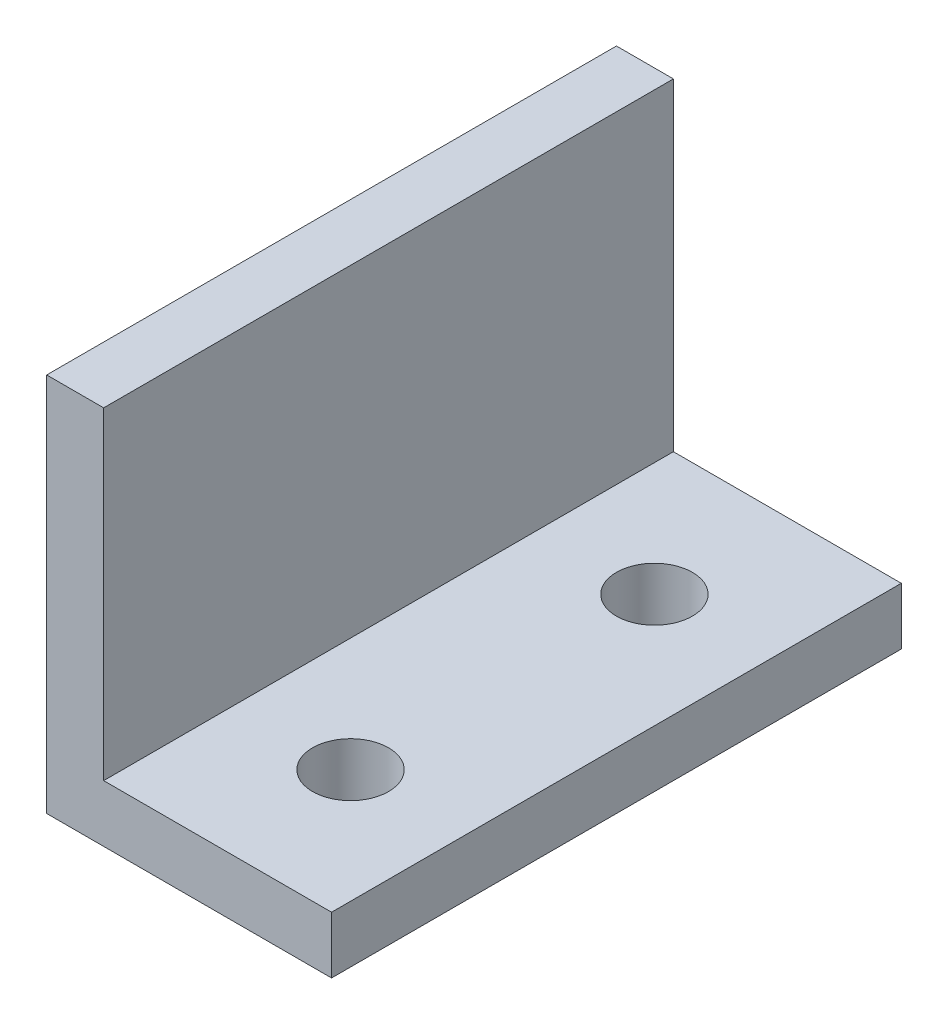
ISO-10303-21;
HEADER;
FILE_DESCRIPTION(('STEP AP214'),'2;1');
FILE_NAME('part.step','',(''),(''),'','','');
FILE_SCHEMA(('AUTOMOTIVE_DESIGN { 1 0 10303 214 1 1 1 1 }'));
ENDSEC;
DATA;
#1=APPLICATION_CONTEXT('core data for automotive mechanical design processes');
#2=APPLICATION_PROTOCOL_DEFINITION('international standard','automotive_design',2000,#1);
#3=PRODUCT_CONTEXT('',#1,'mechanical');
#4=PRODUCT('Part','Part','',(#3));
#5=PRODUCT_RELATED_PRODUCT_CATEGORY('part','',(#4));
#6=PRODUCT_DEFINITION_FORMATION('','',#4);
#7=PRODUCT_DEFINITION_CONTEXT('part definition',#1,'design');
#8=PRODUCT_DEFINITION('design','',#6,#7);
#9=PRODUCT_DEFINITION_SHAPE('','',#8);
#10=(LENGTH_UNIT() NAMED_UNIT(*) SI_UNIT(.MILLI.,.METRE.));
#11=(NAMED_UNIT(*) PLANE_ANGLE_UNIT() SI_UNIT($,.RADIAN.));
#12=(NAMED_UNIT(*) SI_UNIT($,.STERADIAN.) SOLID_ANGLE_UNIT());
#13=UNCERTAINTY_MEASURE_WITH_UNIT(LENGTH_MEASURE(1.E-05),#10,'distance_accuracy_value','');
#14=(GEOMETRIC_REPRESENTATION_CONTEXT(3) GLOBAL_UNCERTAINTY_ASSIGNED_CONTEXT((#13)) GLOBAL_UNIT_ASSIGNED_CONTEXT((#10,
#11,#12)) REPRESENTATION_CONTEXT('',''));
#15=CARTESIAN_POINT('',(0.,0.,0.));
#16=DIRECTION('',(0.,0.,1.));
#17=DIRECTION('',(1.,0.,0.));
#18=AXIS2_PLACEMENT_3D('',#15,#16,#17);
#19=CARTESIAN_POINT('',(0.,0.,30.));
#20=DIRECTION('',(0.,1.,0.));
#21=DIRECTION('',(0.,0.,1.));
#22=AXIS2_PLACEMENT_3D('',#19,#20,#21);
#23=PLANE('',#22);
#24=CARTESIAN_POINT('',(9.,0.,23.));
#25=DIRECTION('',(0.,1.,0.));
#26=DIRECTION('',(1.,0.,0.));
#27=AXIS2_PLACEMENT_3D('',#24,#25,#26);
#28=CIRCLE('',#27,2.);
#29=CARTESIAN_POINT('',(11.,0.,23.));
#30=VERTEX_POINT('',#29);
#31=EDGE_CURVE('E125',#30,#30,#28,.T.);
#32=ORIENTED_EDGE('',*,*,#31,.T.);
#33=EDGE_LOOP('',(#32));
#34=FACE_BOUND('',#33,.T.);
#35=CARTESIAN_POINT('',(9.,0.,7.));
#36=DIRECTION('',(0.,1.,0.));
#37=DIRECTION('',(-1.,0.,0.));
#38=AXIS2_PLACEMENT_3D('',#35,#36,#37);
#39=CIRCLE('',#38,2.);
#40=CARTESIAN_POINT('',(7.,0.,7.));
#41=VERTEX_POINT('',#40);
#42=EDGE_CURVE('E166',#41,#41,#39,.T.);
#43=ORIENTED_EDGE('',*,*,#42,.T.);
#44=EDGE_LOOP('',(#43));
#45=FACE_BOUND('',#44,.T.);
#46=DIRECTION('',(1.,0.,0.));
#47=VECTOR('',#46,1.);
#48=CARTESIAN_POINT('',(0.,0.,0.));
#49=LINE('',#48,#47);
#50=CARTESIAN_POINT('',(0.,0.,0.));
#51=VERTEX_POINT('',#50);
#52=CARTESIAN_POINT('',(15.,0.,0.));
#53=VERTEX_POINT('',#52);
#54=EDGE_CURVE('E121',#51,#53,#49,.T.);
#55=ORIENTED_EDGE('',*,*,#54,.T.);
#56=DIRECTION('',(0.,0.,-1.));
#57=VECTOR('',#56,1.);
#58=CARTESIAN_POINT('',(15.,0.,30.));
#59=LINE('',#58,#57);
#60=CARTESIAN_POINT('',(15.,0.,30.));
#61=VERTEX_POINT('',#60);
#62=EDGE_CURVE('E11',#61,#53,#59,.T.);
#63=ORIENTED_EDGE('',*,*,#62,.F.);
#64=DIRECTION('',(1.,0.,0.));
#65=VECTOR('',#64,1.);
#66=CARTESIAN_POINT('',(0.,0.,30.));
#67=LINE('',#66,#65);
#68=CARTESIAN_POINT('',(0.,0.,30.));
#69=VERTEX_POINT('',#68);
#70=EDGE_CURVE('E132',#69,#61,#67,.T.);
#71=ORIENTED_EDGE('',*,*,#70,.F.);
#72=DIRECTION('',(0.,0.,-1.));
#73=VECTOR('',#72,1.);
#74=CARTESIAN_POINT('',(0.,0.,30.));
#75=LINE('',#74,#73);
#76=EDGE_CURVE('E117',#69,#51,#75,.T.);
#77=ORIENTED_EDGE('',*,*,#76,.T.);
#78=EDGE_LOOP('',(#55,#63,#71,#77));
#79=FACE_BOUND('',#78,.T.);
#80=ADVANCED_FACE('F37',(#34,#45,#79),#23,.F.);
#81=CARTESIAN_POINT('',(15.,0.,30.));
#82=DIRECTION('',(-1.,0.,0.));
#83=DIRECTION('',(0.,0.,1.));
#84=AXIS2_PLACEMENT_3D('',#81,#82,#83);
#85=PLANE('',#84);
#86=DIRECTION('',(0.,1.,0.));
#87=VECTOR('',#86,1.);
#88=CARTESIAN_POINT('',(15.,0.,0.));
#89=LINE('',#88,#87);
#90=CARTESIAN_POINT('',(15.,3.,0.));
#91=VERTEX_POINT('',#90);
#92=EDGE_CURVE('E124',#53,#91,#89,.T.);
#93=ORIENTED_EDGE('',*,*,#92,.T.);
#94=DIRECTION('',(0.,0.,-1.));
#95=VECTOR('',#94,1.);
#96=CARTESIAN_POINT('',(15.,3.,30.));
#97=LINE('',#96,#95);
#98=CARTESIAN_POINT('',(15.,3.,30.));
#99=VERTEX_POINT('',#98);
#100=EDGE_CURVE('E45',#99,#91,#97,.T.);
#101=ORIENTED_EDGE('',*,*,#100,.F.);
#102=DIRECTION('',(0.,1.,0.));
#103=VECTOR('',#102,1.);
#104=CARTESIAN_POINT('',(15.,0.,30.));
#105=LINE('',#104,#103);
#106=EDGE_CURVE('E90',#61,#99,#105,.T.);
#107=ORIENTED_EDGE('',*,*,#106,.F.);
#108=ORIENTED_EDGE('',*,*,#62,.T.);
#109=EDGE_LOOP('',(#93,#101,#107,#108));
#110=FACE_BOUND('',#109,.T.);
#111=ADVANCED_FACE('F156',(#110),#85,.F.);
#112=CARTESIAN_POINT('',(15.,3.,30.));
#113=DIRECTION('',(0.,-1.,0.));
#114=DIRECTION('',(1.,0.,0.));
#115=AXIS2_PLACEMENT_3D('',#112,#113,#114);
#116=PLANE('',#115);
#117=CARTESIAN_POINT('',(9.,3.,23.));
#118=DIRECTION('',(0.,1.,0.));
#119=DIRECTION('',(1.,0.,0.));
#120=AXIS2_PLACEMENT_3D('',#117,#118,#119);
#121=CIRCLE('',#120,2.);
#122=CARTESIAN_POINT('',(11.,3.,23.));
#123=VERTEX_POINT('',#122);
#124=EDGE_CURVE('E171',#123,#123,#121,.T.);
#125=ORIENTED_EDGE('',*,*,#124,.F.);
#126=EDGE_LOOP('',(#125));
#127=FACE_BOUND('',#126,.T.);
#128=CARTESIAN_POINT('',(9.,3.,7.));
#129=DIRECTION('',(0.,1.,0.));
#130=DIRECTION('',(-1.,0.,0.));
#131=AXIS2_PLACEMENT_3D('',#128,#129,#130);
#132=CIRCLE('',#131,2.);
#133=CARTESIAN_POINT('',(7.,3.,7.));
#134=VERTEX_POINT('',#133);
#135=EDGE_CURVE('E168',#134,#134,#132,.T.);
#136=ORIENTED_EDGE('',*,*,#135,.F.);
#137=EDGE_LOOP('',(#136));
#138=FACE_BOUND('',#137,.T.);
#139=DIRECTION('',(-1.,0.,0.));
#140=VECTOR('',#139,1.);
#141=CARTESIAN_POINT('',(15.,3.,0.));
#142=LINE('',#141,#140);
#143=CARTESIAN_POINT('',(3.,3.,0.));
#144=VERTEX_POINT('',#143);
#145=EDGE_CURVE('E127',#91,#144,#142,.T.);
#146=ORIENTED_EDGE('',*,*,#145,.T.);
#147=DIRECTION('',(0.,0.,-1.));
#148=VECTOR('',#147,1.);
#149=CARTESIAN_POINT('',(3.,3.,30.));
#150=LINE('',#149,#148);
#151=CARTESIAN_POINT('',(3.,3.,30.));
#152=VERTEX_POINT('',#151);
#153=EDGE_CURVE('E112',#152,#144,#150,.T.);
#154=ORIENTED_EDGE('',*,*,#153,.F.);
#155=DIRECTION('',(-1.,0.,0.));
#156=VECTOR('',#155,1.);
#157=CARTESIAN_POINT('',(15.,3.,30.));
#158=LINE('',#157,#156);
#159=EDGE_CURVE('E103',#99,#152,#158,.T.);
#160=ORIENTED_EDGE('',*,*,#159,.F.);
#161=ORIENTED_EDGE('',*,*,#100,.T.);
#162=EDGE_LOOP('',(#146,#154,#160,#161));
#163=FACE_BOUND('',#162,.T.);
#164=ADVANCED_FACE('F138',(#127,#138,#163),#116,.F.);
#165=CARTESIAN_POINT('',(3.,3.,30.));
#166=DIRECTION('',(-1.,0.,0.));
#167=DIRECTION('',(0.,-1.,0.));
#168=AXIS2_PLACEMENT_3D('',#165,#166,#167);
#169=PLANE('',#168);
#170=DIRECTION('',(0.,1.,0.));
#171=VECTOR('',#170,1.);
#172=CARTESIAN_POINT('',(3.,3.,0.));
#173=LINE('',#172,#171);
#174=CARTESIAN_POINT('',(3.,20.,0.));
#175=VERTEX_POINT('',#174);
#176=EDGE_CURVE('E111',#144,#175,#173,.T.);
#177=ORIENTED_EDGE('',*,*,#176,.T.);
#178=DIRECTION('',(0.,0.,-1.));
#179=VECTOR('',#178,1.);
#180=CARTESIAN_POINT('',(3.,20.,30.));
#181=LINE('',#180,#179);
#182=CARTESIAN_POINT('',(3.,20.,30.));
#183=VERTEX_POINT('',#182);
#184=EDGE_CURVE('E108',#183,#175,#181,.T.);
#185=ORIENTED_EDGE('',*,*,#184,.F.);
#186=DIRECTION('',(0.,1.,0.));
#187=VECTOR('',#186,1.);
#188=CARTESIAN_POINT('',(3.,3.,30.));
#189=LINE('',#188,#187);
#190=EDGE_CURVE('E97',#152,#183,#189,.T.);
#191=ORIENTED_EDGE('',*,*,#190,.F.);
#192=ORIENTED_EDGE('',*,*,#153,.T.);
#193=EDGE_LOOP('',(#177,#185,#191,#192));
#194=FACE_BOUND('',#193,.T.);
#195=ADVANCED_FACE('F109',(#194),#169,.F.);
#196=CARTESIAN_POINT('',(0.,20.,30.));
#197=DIRECTION('',(0.,-1.,0.));
#198=DIRECTION('',(0.,0.,-1.));
#199=AXIS2_PLACEMENT_3D('',#196,#197,#198);
#200=PLANE('',#199);
#201=DIRECTION('',(-1.,0.,0.));
#202=VECTOR('',#201,1.);
#203=CARTESIAN_POINT('',(0.,20.,0.));
#204=LINE('',#203,#202);
#205=CARTESIAN_POINT('',(0.,20.,0.));
#206=VERTEX_POINT('',#205);
#207=EDGE_CURVE('E76',#175,#206,#204,.T.);
#208=ORIENTED_EDGE('',*,*,#207,.T.);
#209=DIRECTION('',(0.,0.,-1.));
#210=VECTOR('',#209,1.);
#211=CARTESIAN_POINT('',(0.,20.,30.));
#212=LINE('',#211,#210);
#213=CARTESIAN_POINT('',(0.,20.,30.));
#214=VERTEX_POINT('',#213);
#215=EDGE_CURVE('E113',#214,#206,#212,.T.);
#216=ORIENTED_EDGE('',*,*,#215,.F.);
#217=DIRECTION('',(-1.,0.,0.));
#218=VECTOR('',#217,1.);
#219=CARTESIAN_POINT('',(0.,20.,30.));
#220=LINE('',#219,#218);
#221=EDGE_CURVE('E101',#183,#214,#220,.T.);
#222=ORIENTED_EDGE('',*,*,#221,.F.);
#223=ORIENTED_EDGE('',*,*,#184,.T.);
#224=EDGE_LOOP('',(#208,#216,#222,#223));
#225=FACE_BOUND('',#224,.T.);
#226=ADVANCED_FACE('F115',(#225),#200,.F.);
#227=CARTESIAN_POINT('',(0.,0.,30.));
#228=DIRECTION('',(1.,0.,0.));
#229=DIRECTION('',(0.,0.,-1.));
#230=AXIS2_PLACEMENT_3D('',#227,#228,#229);
#231=PLANE('',#230);
#232=DIRECTION('',(0.,-1.,0.));
#233=VECTOR('',#232,1.);
#234=CARTESIAN_POINT('',(0.,0.,0.));
#235=LINE('',#234,#233);
#236=EDGE_CURVE('E82',#206,#51,#235,.T.);
#237=ORIENTED_EDGE('',*,*,#236,.T.);
#238=ORIENTED_EDGE('',*,*,#76,.F.);
#239=DIRECTION('',(0.,-1.,0.));
#240=VECTOR('',#239,1.);
#241=CARTESIAN_POINT('',(0.,0.,30.));
#242=LINE('',#241,#240);
#243=EDGE_CURVE('E53',#214,#69,#242,.T.);
#244=ORIENTED_EDGE('',*,*,#243,.F.);
#245=ORIENTED_EDGE('',*,*,#215,.T.);
#246=EDGE_LOOP('',(#237,#238,#244,#245));
#247=FACE_BOUND('',#246,.T.);
#248=ADVANCED_FACE('F145',(#247),#231,.F.);
#249=CARTESIAN_POINT('',(0.,0.,30.));
#250=DIRECTION('',(0.,0.,1.));
#251=DIRECTION('',(1.,0.,0.));
#252=AXIS2_PLACEMENT_3D('',#249,#250,#251);
#253=PLANE('',#252);
#254=ORIENTED_EDGE('',*,*,#70,.T.);
#255=ORIENTED_EDGE('',*,*,#106,.T.);
#256=ORIENTED_EDGE('',*,*,#159,.T.);
#257=ORIENTED_EDGE('',*,*,#190,.T.);
#258=ORIENTED_EDGE('',*,*,#221,.T.);
#259=ORIENTED_EDGE('',*,*,#243,.T.);
#260=EDGE_LOOP('',(#254,#255,#256,#257,#258,#259));
#261=FACE_BOUND('',#260,.T.);
#262=ADVANCED_FACE('F99',(#261),#253,.T.);
#263=CARTESIAN_POINT('',(0.,0.,0.));
#264=DIRECTION('',(0.,0.,1.));
#265=DIRECTION('',(1.,0.,0.));
#266=AXIS2_PLACEMENT_3D('',#263,#264,#265);
#267=PLANE('',#266);
#268=ORIENTED_EDGE('',*,*,#54,.F.);
#269=ORIENTED_EDGE('',*,*,#236,.F.);
#270=ORIENTED_EDGE('',*,*,#207,.F.);
#271=ORIENTED_EDGE('',*,*,#176,.F.);
#272=ORIENTED_EDGE('',*,*,#145,.F.);
#273=ORIENTED_EDGE('',*,*,#92,.F.);
#274=EDGE_LOOP('',(#268,#269,#270,#271,#272,#273));
#275=FACE_BOUND('',#274,.T.);
#276=ADVANCED_FACE('F141',(#275),#267,.F.);
#277=CARTESIAN_POINT('',(9.,0.,7.));
#278=DIRECTION('',(0.,1.,0.));
#279=DIRECTION('',(-1.,0.,0.));
#280=AXIS2_PLACEMENT_3D('',#277,#278,#279);
#281=CYLINDRICAL_SURFACE('',#280,2.);
#282=ORIENTED_EDGE('',*,*,#42,.F.);
#283=EDGE_LOOP('',(#282));
#284=FACE_BOUND('',#283,.T.);
#285=ORIENTED_EDGE('',*,*,#135,.T.);
#286=EDGE_LOOP('',(#285));
#287=FACE_BOUND('',#286,.T.);
#288=ADVANCED_FACE('F187',(#284,#287),#281,.F.);
#289=CARTESIAN_POINT('',(9.,0.,23.));
#290=DIRECTION('',(0.,1.,0.));
#291=DIRECTION('',(-1.,0.,0.));
#292=AXIS2_PLACEMENT_3D('',#289,#290,#291);
#293=CYLINDRICAL_SURFACE('',#292,2.);
#294=ORIENTED_EDGE('',*,*,#31,.F.);
#295=EDGE_LOOP('',(#294));
#296=FACE_BOUND('',#295,.T.);
#297=ORIENTED_EDGE('',*,*,#124,.T.);
#298=EDGE_LOOP('',(#297));
#299=FACE_BOUND('',#298,.T.);
#300=ADVANCED_FACE('F180',(#296,#299),#293,.F.);
#301=CLOSED_SHELL('',(#80,#111,#164,#195,#226,#248,#262,#276,#288,#300));
#302=MANIFOLD_SOLID_BREP('B2',#301);
#303=ADVANCED_BREP_SHAPE_REPRESENTATION('',(#18,#302),#14);
#304=SHAPE_DEFINITION_REPRESENTATION(#9,#303);
ENDSEC;
END-ISO-10303-21;
